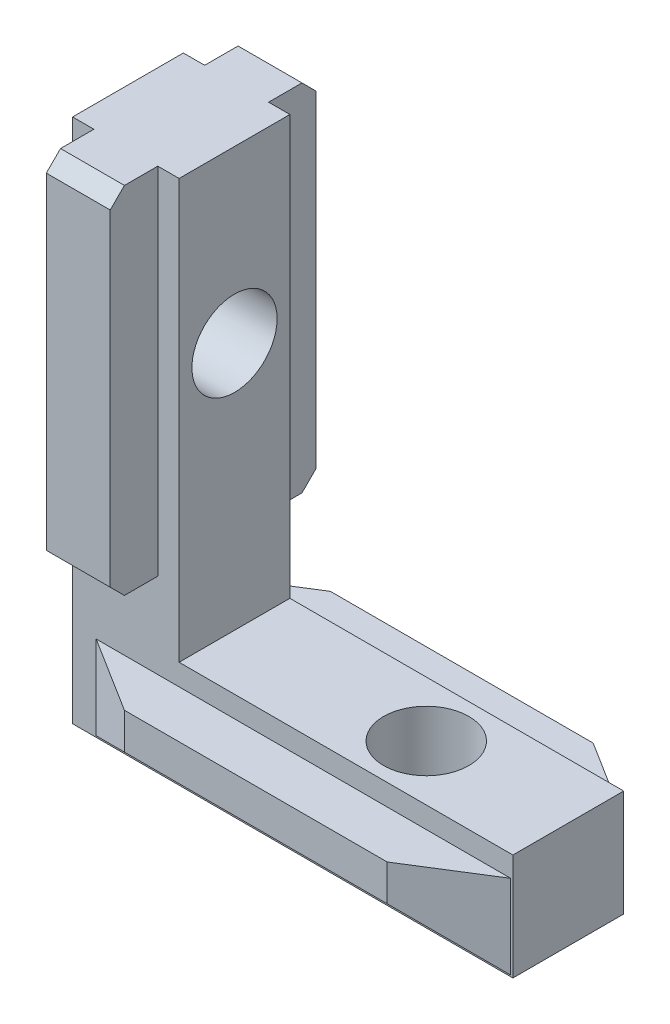
ISO-10303-21;
HEADER;
FILE_DESCRIPTION(('STEP AP214'),'2;1');
FILE_NAME('part.step','',(''),(''),'','','');
FILE_SCHEMA(('AUTOMOTIVE_DESIGN { 1 0 10303 214 1 1 1 1 }'));
ENDSEC;
DATA;
#1=APPLICATION_CONTEXT('core data for automotive mechanical design processes');
#2=APPLICATION_PROTOCOL_DEFINITION('international standard','automotive_design',2000,#1);
#3=PRODUCT_CONTEXT('',#1,'mechanical');
#4=PRODUCT('Part','Part','',(#3));
#5=PRODUCT_RELATED_PRODUCT_CATEGORY('part','',(#4));
#6=PRODUCT_DEFINITION_FORMATION('','',#4);
#7=PRODUCT_DEFINITION_CONTEXT('part definition',#1,'design');
#8=PRODUCT_DEFINITION('design','',#6,#7);
#9=PRODUCT_DEFINITION_SHAPE('','',#8);
#10=(LENGTH_UNIT() NAMED_UNIT(*) SI_UNIT(.MILLI.,.METRE.));
#11=(NAMED_UNIT(*) PLANE_ANGLE_UNIT() SI_UNIT($,.RADIAN.));
#12=(NAMED_UNIT(*) SI_UNIT($,.STERADIAN.) SOLID_ANGLE_UNIT());
#13=UNCERTAINTY_MEASURE_WITH_UNIT(LENGTH_MEASURE(1.E-05),#10,'distance_accuracy_value','');
#14=(GEOMETRIC_REPRESENTATION_CONTEXT(3) GLOBAL_UNCERTAINTY_ASSIGNED_CONTEXT((#13)) GLOBAL_UNIT_ASSIGNED_CONTEXT((#10,
#11,#12)) REPRESENTATION_CONTEXT('',''));
#15=CARTESIAN_POINT('',(0.,0.,0.));
#16=DIRECTION('',(0.,0.,1.));
#17=DIRECTION('',(1.,0.,0.));
#18=AXIS2_PLACEMENT_3D('',#15,#16,#17);
#19=CARTESIAN_POINT('',(0.,0.,-3.9));
#20=DIRECTION('',(0.,0.,1.));
#21=DIRECTION('',(1.,0.,0.));
#22=AXIS2_PLACEMENT_3D('',#19,#20,#21);
#23=PLANE('',#22);
#24=DIRECTION('',(0.,-1.,0.));
#25=VECTOR('',#24,1.);
#26=CARTESIAN_POINT('',(6.,12.,-3.9));
#27=LINE('',#26,#25);
#28=CARTESIAN_POINT('',(6.,37.,-3.9));
#29=VERTEX_POINT('',#28);
#30=CARTESIAN_POINT('',(6.,12.,-3.9));
#31=VERTEX_POINT('',#30);
#32=EDGE_CURVE('E418',#29,#31,#27,.T.);
#33=ORIENTED_EDGE('',*,*,#32,.F.);
#34=DIRECTION('',(-1.,0.,0.));
#35=VECTOR('',#34,1.);
#36=CARTESIAN_POINT('',(31.,37.,-3.9));
#37=LINE('',#36,#35);
#38=CARTESIAN_POINT('',(7.5,37.,-3.9));
#39=VERTEX_POINT('',#38);
#40=EDGE_CURVE('E372',#39,#29,#37,.T.);
#41=ORIENTED_EDGE('',*,*,#40,.F.);
#42=DIRECTION('',(0.,1.,0.));
#43=VECTOR('',#42,1.);
#44=CARTESIAN_POINT('',(7.5,7.5,-3.9));
#45=LINE('',#44,#43);
#46=CARTESIAN_POINT('',(7.5,7.5,-3.9));
#47=VERTEX_POINT('',#46);
#48=EDGE_CURVE('E353',#47,#39,#45,.T.);
#49=ORIENTED_EDGE('',*,*,#48,.F.);
#50=DIRECTION('',(-1.,0.,0.));
#51=VECTOR('',#50,1.);
#52=CARTESIAN_POINT('',(31.,7.5,-3.9));
#53=LINE('',#52,#51);
#54=CARTESIAN_POINT('',(31.,7.5,-3.9));
#55=VERTEX_POINT('',#54);
#56=EDGE_CURVE('E263',#55,#47,#53,.T.);
#57=ORIENTED_EDGE('',*,*,#56,.F.);
#58=DIRECTION('',(0.,1.,0.));
#59=VECTOR('',#58,1.);
#60=CARTESIAN_POINT('',(31.,0.,-3.9));
#61=LINE('',#60,#59);
#62=CARTESIAN_POINT('',(31.,0.,-3.9));
#63=VERTEX_POINT('',#62);
#64=EDGE_CURVE('E367',#63,#55,#61,.T.);
#65=ORIENTED_EDGE('',*,*,#64,.F.);
#66=DIRECTION('',(1.,0.,0.));
#67=VECTOR('',#66,1.);
#68=CARTESIAN_POINT('',(0.,0.,-3.9));
#69=LINE('',#68,#67);
#70=CARTESIAN_POINT('',(0.,0.,-3.9));
#71=VERTEX_POINT('',#70);
#72=EDGE_CURVE('E378',#71,#63,#69,.T.);
#73=ORIENTED_EDGE('',*,*,#72,.F.);
#74=DIRECTION('',(0.,-1.,0.));
#75=VECTOR('',#74,1.);
#76=CARTESIAN_POINT('',(0.,37.,-3.9));
#77=LINE('',#76,#75);
#78=CARTESIAN_POINT('',(0.,37.,-3.9));
#79=VERTEX_POINT('',#78);
#80=EDGE_CURVE('E375',#79,#71,#77,.T.);
#81=ORIENTED_EDGE('',*,*,#80,.F.);
#82=CARTESIAN_POINT('',(1.5,37.,-3.9));
#83=VERTEX_POINT('',#82);
#84=EDGE_CURVE('E370',#83,#79,#37,.T.);
#85=ORIENTED_EDGE('',*,*,#84,.F.);
#86=DIRECTION('',(0.,1.,0.));
#87=VECTOR('',#86,1.);
#88=CARTESIAN_POINT('',(1.5,37.,-3.9));
#89=LINE('',#88,#87);
#90=CARTESIAN_POINT('',(1.5,12.,-3.9));
#91=VERTEX_POINT('',#90);
#92=EDGE_CURVE('E424',#91,#83,#89,.T.);
#93=ORIENTED_EDGE('',*,*,#92,.F.);
#94=DIRECTION('',(-1.,0.,0.));
#95=VECTOR('',#94,1.);
#96=CARTESIAN_POINT('',(1.5,12.,-3.9));
#97=LINE('',#96,#95);
#98=EDGE_CURVE('E401',#31,#91,#97,.T.);
#99=ORIENTED_EDGE('',*,*,#98,.F.);
#100=EDGE_LOOP('',(#33,#41,#49,#57,#65,#73,#81,#85,#93,#99));
#101=FACE_BOUND('',#100,.T.);
#102=DIRECTION('',(1.,0.,0.));
#103=VECTOR('',#102,1.);
#104=CARTESIAN_POINT('',(30.8405797101493,6.,-3.9));
#105=LINE('',#104,#103);
#106=CARTESIAN_POINT('',(1.65942028985501,6.,-3.9));
#107=VERTEX_POINT('',#106);
#108=CARTESIAN_POINT('',(30.8405797101493,6.,-3.9));
#109=VERTEX_POINT('',#108);
#110=EDGE_CURVE('E212',#107,#109,#105,.T.);
#111=ORIENTED_EDGE('',*,*,#110,.F.);
#112=DIRECTION('',(0.,1.,0.));
#113=VECTOR('',#112,1.);
#114=CARTESIAN_POINT('',(1.65942028985501,6.,-3.9));
#115=LINE('',#114,#113);
#116=CARTESIAN_POINT('',(1.65942028985499,0.0999999999999989,-3.9));
#117=VERTEX_POINT('',#116);
#118=EDGE_CURVE('E214',#117,#107,#115,.T.);
#119=ORIENTED_EDGE('',*,*,#118,.F.);
#120=DIRECTION('',(-1.,0.,0.));
#121=VECTOR('',#120,1.);
#122=CARTESIAN_POINT('',(1.65942028985499,0.0999999999999989,-3.9));
#123=LINE('',#122,#121);
#124=CARTESIAN_POINT('',(30.8405797101493,0.0999999999999996,-3.9));
#125=VERTEX_POINT('',#124);
#126=EDGE_CURVE('E234',#125,#117,#123,.T.);
#127=ORIENTED_EDGE('',*,*,#126,.F.);
#128=DIRECTION('',(0.,-1.,0.));
#129=VECTOR('',#128,1.);
#130=CARTESIAN_POINT('',(30.8405797101493,0.0999999999999996,-3.9));
#131=LINE('',#130,#129);
#132=EDGE_CURVE('E217',#109,#125,#131,.T.);
#133=ORIENTED_EDGE('',*,*,#132,.F.);
#134=EDGE_LOOP('',(#111,#119,#127,#133));
#135=FACE_BOUND('',#134,.T.);
#136=ADVANCED_FACE('F41',(#101,#135),#23,.F.);
#137=CARTESIAN_POINT('',(0.,0.,3.9));
#138=DIRECTION('',(0.,0.,1.));
#139=DIRECTION('',(1.,0.,0.));
#140=AXIS2_PLACEMENT_3D('',#137,#138,#139);
#141=PLANE('',#140);
#142=DIRECTION('',(1.,0.,0.));
#143=VECTOR('',#142,1.);
#144=CARTESIAN_POINT('',(30.8405797101493,0.1,3.9));
#145=LINE('',#144,#143);
#146=CARTESIAN_POINT('',(1.659420289855,0.1,3.9));
#147=VERTEX_POINT('',#146);
#148=CARTESIAN_POINT('',(30.8405797101493,0.1,3.9));
#149=VERTEX_POINT('',#148);
#150=EDGE_CURVE('E343',#147,#149,#145,.T.);
#151=ORIENTED_EDGE('',*,*,#150,.F.);
#152=DIRECTION('',(0.,-1.,0.));
#153=VECTOR('',#152,1.);
#154=CARTESIAN_POINT('',(1.659420289855,0.1,3.9));
#155=LINE('',#154,#153);
#156=CARTESIAN_POINT('',(1.659420289855,6.,3.9));
#157=VERTEX_POINT('',#156);
#158=EDGE_CURVE('E339',#157,#147,#155,.T.);
#159=ORIENTED_EDGE('',*,*,#158,.F.);
#160=DIRECTION('',(-1.,0.,0.));
#161=VECTOR('',#160,1.);
#162=CARTESIAN_POINT('',(1.659420289855,6.,3.9));
#163=LINE('',#162,#161);
#164=CARTESIAN_POINT('',(30.8405797101493,6.,3.9));
#165=VERTEX_POINT('',#164);
#166=EDGE_CURVE('E261',#165,#157,#163,.T.);
#167=ORIENTED_EDGE('',*,*,#166,.F.);
#168=DIRECTION('',(0.,1.,0.));
#169=VECTOR('',#168,1.);
#170=CARTESIAN_POINT('',(30.8405797101493,6.,3.9));
#171=LINE('',#170,#169);
#172=EDGE_CURVE('E345',#149,#165,#171,.T.);
#173=ORIENTED_EDGE('',*,*,#172,.F.);
#174=EDGE_LOOP('',(#151,#159,#167,#173));
#175=FACE_BOUND('',#174,.T.);
#176=DIRECTION('',(-1.,0.,0.));
#177=VECTOR('',#176,1.);
#178=CARTESIAN_POINT('',(31.,37.,3.9));
#179=LINE('',#178,#177);
#180=CARTESIAN_POINT('',(7.5,37.,3.9));
#181=VERTEX_POINT('',#180);
#182=CARTESIAN_POINT('',(6.,37.,3.9));
#183=VERTEX_POINT('',#182);
#184=EDGE_CURVE('E384',#181,#183,#179,.T.);
#185=ORIENTED_EDGE('',*,*,#184,.T.);
#186=DIRECTION('',(0.,1.,0.));
#187=VECTOR('',#186,1.);
#188=CARTESIAN_POINT('',(6.,37.,3.9));
#189=LINE('',#188,#187);
#190=CARTESIAN_POINT('',(6.,12.,3.9));
#191=VERTEX_POINT('',#190);
#192=EDGE_CURVE('E440',#191,#183,#189,.T.);
#193=ORIENTED_EDGE('',*,*,#192,.F.);
#194=DIRECTION('',(1.,0.,0.));
#195=VECTOR('',#194,1.);
#196=CARTESIAN_POINT('',(6.,12.,3.9));
#197=LINE('',#196,#195);
#198=CARTESIAN_POINT('',(1.5,12.,3.9));
#199=VERTEX_POINT('',#198);
#200=EDGE_CURVE('E435',#199,#191,#197,.T.);
#201=ORIENTED_EDGE('',*,*,#200,.F.);
#202=DIRECTION('',(0.,-1.,0.));
#203=VECTOR('',#202,1.);
#204=CARTESIAN_POINT('',(1.5,12.,3.9));
#205=LINE('',#204,#203);
#206=CARTESIAN_POINT('',(1.5,37.,3.9));
#207=VERTEX_POINT('',#206);
#208=EDGE_CURVE('E316',#207,#199,#205,.T.);
#209=ORIENTED_EDGE('',*,*,#208,.F.);
#210=CARTESIAN_POINT('',(0.,37.,3.9));
#211=VERTEX_POINT('',#210);
#212=EDGE_CURVE('E329',#207,#211,#179,.T.);
#213=ORIENTED_EDGE('',*,*,#212,.T.);
#214=DIRECTION('',(0.,-1.,0.));
#215=VECTOR('',#214,1.);
#216=CARTESIAN_POINT('',(0.,37.,3.9));
#217=LINE('',#216,#215);
#218=CARTESIAN_POINT('',(0.,0.,3.9));
#219=VERTEX_POINT('',#218);
#220=EDGE_CURVE('E387',#211,#219,#217,.T.);
#221=ORIENTED_EDGE('',*,*,#220,.T.);
#222=DIRECTION('',(1.,0.,0.));
#223=VECTOR('',#222,1.);
#224=CARTESIAN_POINT('',(0.,0.,3.9));
#225=LINE('',#224,#223);
#226=CARTESIAN_POINT('',(31.,0.,3.9));
#227=VERTEX_POINT('',#226);
#228=EDGE_CURVE('E371',#219,#227,#225,.T.);
#229=ORIENTED_EDGE('',*,*,#228,.T.);
#230=DIRECTION('',(0.,1.,0.));
#231=VECTOR('',#230,1.);
#232=CARTESIAN_POINT('',(31.,0.,3.9));
#233=LINE('',#232,#231);
#234=CARTESIAN_POINT('',(31.,7.5,3.9));
#235=VERTEX_POINT('',#234);
#236=EDGE_CURVE('E363',#227,#235,#233,.T.);
#237=ORIENTED_EDGE('',*,*,#236,.T.);
#238=DIRECTION('',(-1.,0.,0.));
#239=VECTOR('',#238,1.);
#240=CARTESIAN_POINT('',(31.,7.5,3.9));
#241=LINE('',#240,#239);
#242=CARTESIAN_POINT('',(7.5,7.5,3.9));
#243=VERTEX_POINT('',#242);
#244=EDGE_CURVE('E349',#235,#243,#241,.T.);
#245=ORIENTED_EDGE('',*,*,#244,.T.);
#246=DIRECTION('',(0.,1.,0.));
#247=VECTOR('',#246,1.);
#248=CARTESIAN_POINT('',(7.5,7.5,3.9));
#249=LINE('',#248,#247);
#250=EDGE_CURVE('E352',#243,#181,#249,.T.);
#251=ORIENTED_EDGE('',*,*,#250,.T.);
#252=EDGE_LOOP('',(#185,#193,#201,#209,#213,#221,#229,#237,#245,#251));
#253=FACE_BOUND('',#252,.T.);
#254=ADVANCED_FACE('F444',(#175,#253),#141,.T.);
#255=CARTESIAN_POINT('',(31.,0.,-3.9));
#256=DIRECTION('',(1.,0.,0.));
#257=DIRECTION('',(0.,0.,-1.));
#258=AXIS2_PLACEMENT_3D('',#255,#256,#257);
#259=PLANE('',#258);
#260=DIRECTION('',(0.,0.,-1.));
#261=VECTOR('',#260,1.);
#262=CARTESIAN_POINT('',(31.,7.5,3.9));
#263=LINE('',#262,#261);
#264=EDGE_CURVE('E356',#235,#55,#263,.T.);
#265=ORIENTED_EDGE('',*,*,#264,.F.);
#266=ORIENTED_EDGE('',*,*,#236,.F.);
#267=DIRECTION('',(0.,0.,1.));
#268=VECTOR('',#267,1.);
#269=CARTESIAN_POINT('',(31.,0.,-3.9));
#270=LINE('',#269,#268);
#271=EDGE_CURVE('E273',#63,#227,#270,.T.);
#272=ORIENTED_EDGE('',*,*,#271,.F.);
#273=ORIENTED_EDGE('',*,*,#64,.T.);
#274=EDGE_LOOP('',(#265,#266,#272,#273));
#275=FACE_BOUND('',#274,.T.);
#276=ADVANCED_FACE('F464',(#275),#259,.T.);
#277=CARTESIAN_POINT('',(0.,0.,-3.9));
#278=DIRECTION('',(0.,-1.,0.));
#279=DIRECTION('',(1.,0.,0.));
#280=AXIS2_PLACEMENT_3D('',#277,#278,#279);
#281=PLANE('',#280);
#282=CARTESIAN_POINT('',(21.,0.,0.));
#283=DIRECTION('',(0.,-1.,0.));
#284=DIRECTION('',(0.,0.,-1.));
#285=AXIS2_PLACEMENT_3D('',#282,#283,#284);
#286=CIRCLE('',#285,2.99999999999999);
#287=CARTESIAN_POINT('',(21.,0.,-2.99999999999999));
#288=VERTEX_POINT('',#287);
#289=EDGE_CURVE('E268',#288,#288,#286,.T.);
#290=ORIENTED_EDGE('',*,*,#289,.F.);
#291=EDGE_LOOP('',(#290));
#292=FACE_BOUND('',#291,.T.);
#293=ORIENTED_EDGE('',*,*,#228,.F.);
#294=DIRECTION('',(0.,0.,1.));
#295=VECTOR('',#294,1.);
#296=CARTESIAN_POINT('',(0.,0.,-3.9));
#297=LINE('',#296,#295);
#298=EDGE_CURVE('E393',#71,#219,#297,.T.);
#299=ORIENTED_EDGE('',*,*,#298,.F.);
#300=ORIENTED_EDGE('',*,*,#72,.T.);
#301=ORIENTED_EDGE('',*,*,#271,.T.);
#302=EDGE_LOOP('',(#293,#299,#300,#301));
#303=FACE_BOUND('',#302,.T.);
#304=ADVANCED_FACE('F472',(#292,#303),#281,.T.);
#305=CARTESIAN_POINT('',(0.,37.,-3.9));
#306=DIRECTION('',(-1.,0.,0.));
#307=DIRECTION('',(0.,0.,1.));
#308=AXIS2_PLACEMENT_3D('',#305,#306,#307);
#309=PLANE('',#308);
#310=CARTESIAN_POINT('',(0.,25.,0.));
#311=DIRECTION('',(1.,0.,0.));
#312=DIRECTION('',(0.,0.,-1.));
#313=AXIS2_PLACEMENT_3D('',#310,#311,#312);
#314=CIRCLE('',#313,2.99999999999999);
#315=CARTESIAN_POINT('',(0.,25.,-2.99999999999999));
#316=VERTEX_POINT('',#315);
#317=EDGE_CURVE('E222',#316,#316,#314,.T.);
#318=ORIENTED_EDGE('',*,*,#317,.T.);
#319=EDGE_LOOP('',(#318));
#320=FACE_BOUND('',#319,.T.);
#321=ORIENTED_EDGE('',*,*,#220,.F.);
#322=DIRECTION('',(0.,0.,1.));
#323=VECTOR('',#322,1.);
#324=CARTESIAN_POINT('',(0.,37.,-3.9));
#325=LINE('',#324,#323);
#326=EDGE_CURVE('E381',#79,#211,#325,.T.);
#327=ORIENTED_EDGE('',*,*,#326,.F.);
#328=ORIENTED_EDGE('',*,*,#80,.T.);
#329=ORIENTED_EDGE('',*,*,#298,.T.);
#330=EDGE_LOOP('',(#321,#327,#328,#329));
#331=FACE_BOUND('',#330,.T.);
#332=ADVANCED_FACE('F475',(#320,#331),#309,.T.);
#333=CARTESIAN_POINT('',(31.,37.,-3.9));
#334=DIRECTION('',(0.,1.,0.));
#335=DIRECTION('',(0.,0.,1.));
#336=AXIS2_PLACEMENT_3D('',#333,#334,#335);
#337=PLANE('',#336);
#338=DIRECTION('',(0.,0.,1.));
#339=VECTOR('',#338,1.);
#340=CARTESIAN_POINT('',(6.,37.,-7.25));
#341=LINE('',#340,#339);
#342=CARTESIAN_POINT('',(6.,37.,-6.24999999999999));
#343=VERTEX_POINT('',#342);
#344=EDGE_CURVE('E430',#343,#29,#341,.T.);
#345=ORIENTED_EDGE('',*,*,#344,.F.);
#346=DIRECTION('',(-1.,0.,0.));
#347=VECTOR('',#346,1.);
#348=CARTESIAN_POINT('',(1.5,37.,-6.24999999999999));
#349=LINE('',#348,#347);
#350=CARTESIAN_POINT('',(1.5,37.,-6.24999999999999));
#351=VERTEX_POINT('',#350);
#352=EDGE_CURVE('E282',#343,#351,#349,.T.);
#353=ORIENTED_EDGE('',*,*,#352,.T.);
#354=DIRECTION('',(0.,0.,1.));
#355=VECTOR('',#354,1.);
#356=CARTESIAN_POINT('',(1.5,37.,-7.25));
#357=LINE('',#356,#355);
#358=EDGE_CURVE('E432',#351,#83,#357,.T.);
#359=ORIENTED_EDGE('',*,*,#358,.T.);
#360=ORIENTED_EDGE('',*,*,#84,.T.);
#361=ORIENTED_EDGE('',*,*,#326,.T.);
#362=ORIENTED_EDGE('',*,*,#212,.F.);
#363=DIRECTION('',(0.,0.,-1.));
#364=VECTOR('',#363,1.);
#365=CARTESIAN_POINT('',(1.5,37.,7.25));
#366=LINE('',#365,#364);
#367=CARTESIAN_POINT('',(1.5,37.,6.24999999999999));
#368=VERTEX_POINT('',#367);
#369=EDGE_CURVE('E323',#368,#207,#366,.T.);
#370=ORIENTED_EDGE('',*,*,#369,.F.);
#371=DIRECTION('',(1.,0.,0.));
#372=VECTOR('',#371,1.);
#373=CARTESIAN_POINT('',(6.,37.,6.24999999999999));
#374=LINE('',#373,#372);
#375=CARTESIAN_POINT('',(6.,37.,6.24999999999999));
#376=VERTEX_POINT('',#375);
#377=EDGE_CURVE('E280',#368,#376,#374,.T.);
#378=ORIENTED_EDGE('',*,*,#377,.T.);
#379=DIRECTION('',(0.,0.,-1.));
#380=VECTOR('',#379,1.);
#381=CARTESIAN_POINT('',(6.,37.,7.25));
#382=LINE('',#381,#380);
#383=EDGE_CURVE('E306',#376,#183,#382,.T.);
#384=ORIENTED_EDGE('',*,*,#383,.T.);
#385=ORIENTED_EDGE('',*,*,#184,.F.);
#386=DIRECTION('',(0.,0.,-1.));
#387=VECTOR('',#386,1.);
#388=CARTESIAN_POINT('',(7.5,37.,3.9));
#389=LINE('',#388,#387);
#390=EDGE_CURVE('E360',#181,#39,#389,.T.);
#391=ORIENTED_EDGE('',*,*,#390,.T.);
#392=ORIENTED_EDGE('',*,*,#40,.T.);
#393=EDGE_LOOP('',(#345,#353,#359,#360,#361,#362,#370,#378,#384,#385,#391,#392));
#394=FACE_BOUND('',#393,.T.);
#395=ADVANCED_FACE('F327',(#394),#337,.T.);
#396=CARTESIAN_POINT('',(7.5,7.5,3.9));
#397=DIRECTION('',(-1.,0.,0.));
#398=DIRECTION('',(0.,0.,1.));
#399=AXIS2_PLACEMENT_3D('',#396,#397,#398);
#400=PLANE('',#399);
#401=CARTESIAN_POINT('',(7.5,25.,0.));
#402=DIRECTION('',(1.,0.,0.));
#403=DIRECTION('',(0.,0.,-1.));
#404=AXIS2_PLACEMENT_3D('',#401,#402,#403);
#405=CIRCLE('',#404,2.99999999999999);
#406=CARTESIAN_POINT('',(7.5,25.,-2.99999999999999));
#407=VERTEX_POINT('',#406);
#408=EDGE_CURVE('E267',#407,#407,#405,.T.);
#409=ORIENTED_EDGE('',*,*,#408,.F.);
#410=EDGE_LOOP('',(#409));
#411=FACE_BOUND('',#410,.T.);
#412=ORIENTED_EDGE('',*,*,#48,.T.);
#413=ORIENTED_EDGE('',*,*,#390,.F.);
#414=ORIENTED_EDGE('',*,*,#250,.F.);
#415=DIRECTION('',(0.,0.,-1.));
#416=VECTOR('',#415,1.);
#417=CARTESIAN_POINT('',(7.5,7.5,3.9));
#418=LINE('',#417,#416);
#419=EDGE_CURVE('E364',#243,#47,#418,.T.);
#420=ORIENTED_EDGE('',*,*,#419,.T.);
#421=EDGE_LOOP('',(#412,#413,#414,#420));
#422=FACE_BOUND('',#421,.T.);
#423=ADVANCED_FACE('F482',(#411,#422),#400,.F.);
#424=CARTESIAN_POINT('',(31.,7.5,3.9));
#425=DIRECTION('',(0.,-1.,0.));
#426=DIRECTION('',(0.,0.,-1.));
#427=AXIS2_PLACEMENT_3D('',#424,#425,#426);
#428=PLANE('',#427);
#429=CARTESIAN_POINT('',(21.,7.5,0.));
#430=DIRECTION('',(0.,-1.,0.));
#431=DIRECTION('',(0.,0.,-1.));
#432=AXIS2_PLACEMENT_3D('',#429,#430,#431);
#433=CIRCLE('',#432,2.99999999999999);
#434=CARTESIAN_POINT('',(21.,7.5,-2.99999999999999));
#435=VERTEX_POINT('',#434);
#436=EDGE_CURVE('E264',#435,#435,#433,.T.);
#437=ORIENTED_EDGE('',*,*,#436,.T.);
#438=EDGE_LOOP('',(#437));
#439=FACE_BOUND('',#438,.T.);
#440=ORIENTED_EDGE('',*,*,#56,.T.);
#441=ORIENTED_EDGE('',*,*,#419,.F.);
#442=ORIENTED_EDGE('',*,*,#244,.F.);
#443=ORIENTED_EDGE('',*,*,#264,.T.);
#444=EDGE_LOOP('',(#440,#441,#442,#443));
#445=FACE_BOUND('',#444,.T.);
#446=ADVANCED_FACE('F469',(#439,#445),#428,.F.);
#447=CARTESIAN_POINT('',(1.659420289855,0.1,3.9));
#448=DIRECTION('',(-0.531382718815383,0.,0.847131870575279));
#449=DIRECTION('',(0.847131870575279,0.,0.531382718815383));
#450=AXIS2_PLACEMENT_3D('',#447,#448,#449);
#451=PLANE('',#450);
#452=ORIENTED_EDGE('',*,*,#158,.T.);
#453=DIRECTION('',(-0.748074332358689,-0.469246626661346,-0.469246626661342));
#454=VECTOR('',#453,1.);
#455=CARTESIAN_POINT('',(17.9896408515778,10.3435019887168,14.1435019887167));
#456=LINE('',#455,#454);
#457=CARTESIAN_POINT('',(7.00000000000012,3.45000000000002,7.25));
#458=VERTEX_POINT('',#457);
#459=EDGE_CURVE('E248',#458,#147,#456,.T.);
#460=ORIENTED_EDGE('',*,*,#459,.F.);
#461=DIRECTION('',(0.,1.,0.));
#462=VECTOR('',#461,1.);
#463=CARTESIAN_POINT('',(7.00000000000012,0.,7.25));
#464=LINE('',#463,#462);
#465=CARTESIAN_POINT('',(7.00000000000012,6.,7.25));
#466=VERTEX_POINT('',#465);
#467=EDGE_CURVE('E258',#466,#458,#464,.F.);
#468=ORIENTED_EDGE('',*,*,#467,.F.);
#469=DIRECTION('',(0.847131870575279,0.,0.531382718815383));
#470=VECTOR('',#469,1.);
#471=CARTESIAN_POINT('',(1.659420289855,6.,3.9));
#472=LINE('',#471,#470);
#473=EDGE_CURVE('E255',#466,#157,#472,.F.);
#474=ORIENTED_EDGE('',*,*,#473,.T.);
#475=EDGE_LOOP('',(#452,#460,#468,#474));
#476=FACE_BOUND('',#475,.T.);
#477=ADVANCED_FACE('F492',(#476),#451,.T.);
#478=CARTESIAN_POINT('',(30.8405797101493,0.1,3.9));
#479=DIRECTION('',(0.,-0.707106781186545,0.70710678118655));
#480=DIRECTION('',(0.,-0.70710678118655,-0.707106781186545));
#481=AXIS2_PLACEMENT_3D('',#478,#479,#480);
#482=PLANE('',#481);
#483=ORIENTED_EDGE('',*,*,#150,.T.);
#484=DIRECTION('',(0.748074332358689,-0.469246626661346,-0.469246626661342));
#485=VECTOR('',#484,1.);
#486=CARTESIAN_POINT('',(28.7694947041369,1.39913514013501,5.199135140135));
#487=LINE('',#486,#485);
#488=CARTESIAN_POINT('',(25.5000000000042,3.45000000000002,7.25));
#489=VERTEX_POINT('',#488);
#490=EDGE_CURVE('E245',#489,#149,#487,.T.);
#491=ORIENTED_EDGE('',*,*,#490,.F.);
#492=DIRECTION('',(-1.,0.,0.));
#493=VECTOR('',#492,1.);
#494=CARTESIAN_POINT('',(0.,3.45000000000002,7.25));
#495=LINE('',#494,#493);
#496=EDGE_CURVE('E253',#458,#489,#495,.F.);
#497=ORIENTED_EDGE('',*,*,#496,.F.);
#498=ORIENTED_EDGE('',*,*,#459,.T.);
#499=EDGE_LOOP('',(#483,#491,#497,#498));
#500=FACE_BOUND('',#499,.T.);
#501=ADVANCED_FACE('F488',(#500),#482,.T.);
#502=CARTESIAN_POINT('',(30.8405797101493,6.,3.9));
#503=DIRECTION('',(0.531382718815383,0.,0.847131870575279));
#504=DIRECTION('',(0.847131870575279,0.,-0.531382718815383));
#505=AXIS2_PLACEMENT_3D('',#502,#503,#504);
#506=PLANE('',#505);
#507=ORIENTED_EDGE('',*,*,#172,.T.);
#508=DIRECTION('',(-0.847131870575279,0.,0.531382718815383));
#509=VECTOR('',#508,1.);
#510=CARTESIAN_POINT('',(8.39122741873314,6.,17.9818664373424));
#511=LINE('',#510,#509);
#512=CARTESIAN_POINT('',(25.5000000000042,6.,7.25));
#513=VERTEX_POINT('',#512);
#514=EDGE_CURVE('E249',#513,#165,#511,.F.);
#515=ORIENTED_EDGE('',*,*,#514,.F.);
#516=DIRECTION('',(0.,-1.,0.));
#517=VECTOR('',#516,1.);
#518=CARTESIAN_POINT('',(25.5000000000042,0.,7.25));
#519=LINE('',#518,#517);
#520=EDGE_CURVE('E250',#489,#513,#519,.F.);
#521=ORIENTED_EDGE('',*,*,#520,.F.);
#522=ORIENTED_EDGE('',*,*,#490,.T.);
#523=EDGE_LOOP('',(#507,#515,#521,#522));
#524=FACE_BOUND('',#523,.T.);
#525=ADVANCED_FACE('F491',(#524),#506,.T.);
#526=CARTESIAN_POINT('',(1.659420289855,6.,7.25));
#527=DIRECTION('',(0.,-1.,0.));
#528=DIRECTION('',(0.,0.,-1.));
#529=AXIS2_PLACEMENT_3D('',#526,#527,#528);
#530=PLANE('',#529);
#531=ORIENTED_EDGE('',*,*,#166,.T.);
#532=ORIENTED_EDGE('',*,*,#473,.F.);
#533=DIRECTION('',(-1.,0.,0.));
#534=VECTOR('',#533,1.);
#535=CARTESIAN_POINT('',(1.659420289855,6.,7.25));
#536=LINE('',#535,#534);
#537=EDGE_CURVE('E252',#513,#466,#536,.T.);
#538=ORIENTED_EDGE('',*,*,#537,.F.);
#539=ORIENTED_EDGE('',*,*,#514,.T.);
#540=EDGE_LOOP('',(#531,#532,#538,#539));
#541=FACE_BOUND('',#540,.T.);
#542=ADVANCED_FACE('F501',(#541),#530,.F.);
#543=CARTESIAN_POINT('',(0.,0.,7.25));
#544=DIRECTION('',(0.,0.,-1.));
#545=DIRECTION('',(-1.,0.,0.));
#546=AXIS2_PLACEMENT_3D('',#543,#544,#545);
#547=PLANE('',#546);
#548=ORIENTED_EDGE('',*,*,#467,.T.);
#549=ORIENTED_EDGE('',*,*,#496,.T.);
#550=ORIENTED_EDGE('',*,*,#520,.T.);
#551=ORIENTED_EDGE('',*,*,#537,.T.);
#552=EDGE_LOOP('',(#548,#549,#550,#551));
#553=FACE_BOUND('',#552,.T.);
#554=ADVANCED_FACE('F578',(#553),#547,.F.);
#555=CARTESIAN_POINT('',(6.,12.,7.25));
#556=DIRECTION('',(0.,1.,0.));
#557=DIRECTION('',(0.,0.,1.));
#558=AXIS2_PLACEMENT_3D('',#555,#556,#557);
#559=PLANE('',#558);
#560=DIRECTION('',(0.,0.,-1.));
#561=VECTOR('',#560,1.);
#562=CARTESIAN_POINT('',(6.,12.,7.25));
#563=LINE('',#562,#561);
#564=CARTESIAN_POINT('',(6.,12.,6.24999999999999));
#565=VERTEX_POINT('',#564);
#566=EDGE_CURVE('E333',#565,#191,#563,.T.);
#567=ORIENTED_EDGE('',*,*,#566,.F.);
#568=DIRECTION('',(-1.,0.,0.));
#569=VECTOR('',#568,1.);
#570=CARTESIAN_POINT('',(6.,12.,6.24999999999999));
#571=LINE('',#570,#569);
#572=CARTESIAN_POINT('',(1.5,12.,6.24999999999999));
#573=VERTEX_POINT('',#572);
#574=EDGE_CURVE('E50',#565,#573,#571,.T.);
#575=ORIENTED_EDGE('',*,*,#574,.T.);
#576=DIRECTION('',(0.,0.,-1.));
#577=VECTOR('',#576,1.);
#578=CARTESIAN_POINT('',(1.5,12.,7.25));
#579=LINE('',#578,#577);
#580=EDGE_CURVE('E331',#573,#199,#579,.T.);
#581=ORIENTED_EDGE('',*,*,#580,.T.);
#582=ORIENTED_EDGE('',*,*,#200,.T.);
#583=EDGE_LOOP('',(#567,#575,#581,#582));
#584=FACE_BOUND('',#583,.T.);
#585=ADVANCED_FACE('F446',(#584),#559,.F.);
#586=CARTESIAN_POINT('',(6.,37.,7.25));
#587=DIRECTION('',(-1.,0.,0.));
#588=DIRECTION('',(0.,-1.,0.));
#589=AXIS2_PLACEMENT_3D('',#586,#587,#588);
#590=PLANE('',#589);
#591=ORIENTED_EDGE('',*,*,#383,.F.);
#592=DIRECTION('',(0.,-0.707106781186543,0.707106781186552));
#593=VECTOR('',#592,1.);
#594=CARTESIAN_POINT('',(6.,36.,7.25));
#595=LINE('',#594,#593);
#596=CARTESIAN_POINT('',(6.,36.,7.25));
#597=VERTEX_POINT('',#596);
#598=EDGE_CURVE('E299',#376,#597,#595,.T.);
#599=ORIENTED_EDGE('',*,*,#598,.T.);
#600=DIRECTION('',(0.,1.,0.));
#601=VECTOR('',#600,1.);
#602=CARTESIAN_POINT('',(6.,37.,7.25));
#603=LINE('',#602,#601);
#604=CARTESIAN_POINT('',(6.,13.,7.25));
#605=VERTEX_POINT('',#604);
#606=EDGE_CURVE('E304',#605,#597,#603,.T.);
#607=ORIENTED_EDGE('',*,*,#606,.F.);
#608=DIRECTION('',(0.,0.707106781186545,0.70710678118655));
#609=VECTOR('',#608,1.);
#610=CARTESIAN_POINT('',(6.,13.,7.25));
#611=LINE('',#610,#609);
#612=EDGE_CURVE('E57',#605,#565,#611,.F.);
#613=ORIENTED_EDGE('',*,*,#612,.T.);
#614=ORIENTED_EDGE('',*,*,#566,.T.);
#615=ORIENTED_EDGE('',*,*,#192,.T.);
#616=EDGE_LOOP('',(#591,#599,#607,#613,#614,#615));
#617=FACE_BOUND('',#616,.T.);
#618=ADVANCED_FACE('F303',(#617),#590,.F.);
#619=CARTESIAN_POINT('',(1.5,12.,7.25));
#620=DIRECTION('',(1.,0.,0.));
#621=DIRECTION('',(0.,1.,0.));
#622=AXIS2_PLACEMENT_3D('',#619,#620,#621);
#623=PLANE('',#622);
#624=DIRECTION('',(0.,-1.,0.));
#625=VECTOR('',#624,1.);
#626=CARTESIAN_POINT('',(1.5,12.,7.25));
#627=LINE('',#626,#625);
#628=CARTESIAN_POINT('',(1.5,36.,7.25));
#629=VERTEX_POINT('',#628);
#630=CARTESIAN_POINT('',(1.5,13.,7.25));
#631=VERTEX_POINT('',#630);
#632=EDGE_CURVE('E315',#629,#631,#627,.T.);
#633=ORIENTED_EDGE('',*,*,#632,.F.);
#634=DIRECTION('',(0.,0.707106781186543,-0.707106781186552));
#635=VECTOR('',#634,1.);
#636=CARTESIAN_POINT('',(1.5,36.,7.25));
#637=LINE('',#636,#635);
#638=EDGE_CURVE('E296',#629,#368,#637,.T.);
#639=ORIENTED_EDGE('',*,*,#638,.T.);
#640=ORIENTED_EDGE('',*,*,#369,.T.);
#641=ORIENTED_EDGE('',*,*,#208,.T.);
#642=ORIENTED_EDGE('',*,*,#580,.F.);
#643=DIRECTION('',(0.,-0.707106781186545,-0.70710678118655));
#644=VECTOR('',#643,1.);
#645=CARTESIAN_POINT('',(1.5,13.,7.25));
#646=LINE('',#645,#644);
#647=EDGE_CURVE('E294',#573,#631,#646,.F.);
#648=ORIENTED_EDGE('',*,*,#647,.T.);
#649=EDGE_LOOP('',(#633,#639,#640,#641,#642,#648));
#650=FACE_BOUND('',#649,.T.);
#651=ADVANCED_FACE('F321',(#650),#623,.F.);
#652=CARTESIAN_POINT('',(0.,0.,7.25));
#653=DIRECTION('',(0.,0.,-1.));
#654=DIRECTION('',(-1.,0.,0.));
#655=AXIS2_PLACEMENT_3D('',#652,#653,#654);
#656=PLANE('',#655);
#657=ORIENTED_EDGE('',*,*,#606,.T.);
#658=DIRECTION('',(-1.,0.,0.));
#659=VECTOR('',#658,1.);
#660=CARTESIAN_POINT('',(1.5,36.,7.25));
#661=LINE('',#660,#659);
#662=EDGE_CURVE('E291',#597,#629,#661,.T.);
#663=ORIENTED_EDGE('',*,*,#662,.T.);
#664=ORIENTED_EDGE('',*,*,#632,.T.);
#665=DIRECTION('',(1.,0.,0.));
#666=VECTOR('',#665,1.);
#667=CARTESIAN_POINT('',(0.,13.,7.25));
#668=LINE('',#667,#666);
#669=EDGE_CURVE('E288',#631,#605,#668,.T.);
#670=ORIENTED_EDGE('',*,*,#669,.T.);
#671=EDGE_LOOP('',(#657,#663,#664,#670));
#672=FACE_BOUND('',#671,.T.);
#673=ADVANCED_FACE('F311',(#672),#656,.F.);
#674=CARTESIAN_POINT('',(1.5,12.,-7.25));
#675=DIRECTION('',(0.,1.,0.));
#676=DIRECTION('',(0.,0.,1.));
#677=AXIS2_PLACEMENT_3D('',#674,#675,#676);
#678=PLANE('',#677);
#679=DIRECTION('',(0.,0.,1.));
#680=VECTOR('',#679,1.);
#681=CARTESIAN_POINT('',(1.5,12.,-7.25));
#682=LINE('',#681,#680);
#683=CARTESIAN_POINT('',(1.5,12.,-6.24999999999999));
#684=VERTEX_POINT('',#683);
#685=EDGE_CURVE('E434',#684,#91,#682,.T.);
#686=ORIENTED_EDGE('',*,*,#685,.F.);
#687=DIRECTION('',(1.,0.,0.));
#688=VECTOR('',#687,1.);
#689=CARTESIAN_POINT('',(1.5,12.,-6.24999999999999));
#690=LINE('',#689,#688);
#691=CARTESIAN_POINT('',(6.,12.,-6.24999999999999));
#692=VERTEX_POINT('',#691);
#693=EDGE_CURVE('E11',#684,#692,#690,.T.);
#694=ORIENTED_EDGE('',*,*,#693,.T.);
#695=DIRECTION('',(0.,0.,1.));
#696=VECTOR('',#695,1.);
#697=CARTESIAN_POINT('',(6.,12.,-7.25));
#698=LINE('',#697,#696);
#699=EDGE_CURVE('E421',#692,#31,#698,.T.);
#700=ORIENTED_EDGE('',*,*,#699,.T.);
#701=ORIENTED_EDGE('',*,*,#98,.T.);
#702=EDGE_LOOP('',(#686,#694,#700,#701));
#703=FACE_BOUND('',#702,.T.);
#704=ADVANCED_FACE('F541',(#703),#678,.F.);
#705=CARTESIAN_POINT('',(1.5,37.,-7.25));
#706=DIRECTION('',(1.,0.,0.));
#707=DIRECTION('',(0.,1.,0.));
#708=AXIS2_PLACEMENT_3D('',#705,#706,#707);
#709=PLANE('',#708);
#710=ORIENTED_EDGE('',*,*,#358,.F.);
#711=DIRECTION('',(0.,-0.707106781186543,-0.707106781186552));
#712=VECTOR('',#711,1.);
#713=CARTESIAN_POINT('',(1.5,36.,-7.25));
#714=LINE('',#713,#712);
#715=CARTESIAN_POINT('',(1.5,36.,-7.25));
#716=VERTEX_POINT('',#715);
#717=EDGE_CURVE('E286',#351,#716,#714,.T.);
#718=ORIENTED_EDGE('',*,*,#717,.T.);
#719=DIRECTION('',(0.,1.,0.));
#720=VECTOR('',#719,1.);
#721=CARTESIAN_POINT('',(1.5,37.,-7.25));
#722=LINE('',#721,#720);
#723=CARTESIAN_POINT('',(1.5,13.,-7.25));
#724=VERTEX_POINT('',#723);
#725=EDGE_CURVE('E414',#724,#716,#722,.T.);
#726=ORIENTED_EDGE('',*,*,#725,.F.);
#727=DIRECTION('',(0.,0.707106781186545,-0.70710678118655));
#728=VECTOR('',#727,1.);
#729=CARTESIAN_POINT('',(1.5,13.,-7.25));
#730=LINE('',#729,#728);
#731=EDGE_CURVE('E284',#724,#684,#730,.F.);
#732=ORIENTED_EDGE('',*,*,#731,.T.);
#733=ORIENTED_EDGE('',*,*,#685,.T.);
#734=ORIENTED_EDGE('',*,*,#92,.T.);
#735=EDGE_LOOP('',(#710,#718,#726,#732,#733,#734));
#736=FACE_BOUND('',#735,.T.);
#737=ADVANCED_FACE('F531',(#736),#709,.F.);
#738=CARTESIAN_POINT('',(6.,12.,-7.25));
#739=DIRECTION('',(-1.,0.,0.));
#740=DIRECTION('',(0.,-1.,0.));
#741=AXIS2_PLACEMENT_3D('',#738,#739,#740);
#742=PLANE('',#741);
#743=DIRECTION('',(0.,-1.,0.));
#744=VECTOR('',#743,1.);
#745=CARTESIAN_POINT('',(6.,12.,-7.25));
#746=LINE('',#745,#744);
#747=CARTESIAN_POINT('',(6.,36.,-7.25));
#748=VERTEX_POINT('',#747);
#749=CARTESIAN_POINT('',(6.,13.,-7.25));
#750=VERTEX_POINT('',#749);
#751=EDGE_CURVE('E417',#748,#750,#746,.T.);
#752=ORIENTED_EDGE('',*,*,#751,.F.);
#753=DIRECTION('',(0.,0.707106781186543,0.707106781186552));
#754=VECTOR('',#753,1.);
#755=CARTESIAN_POINT('',(6.,36.,-7.25));
#756=LINE('',#755,#754);
#757=EDGE_CURVE('E278',#748,#343,#756,.T.);
#758=ORIENTED_EDGE('',*,*,#757,.T.);
#759=ORIENTED_EDGE('',*,*,#344,.T.);
#760=ORIENTED_EDGE('',*,*,#32,.T.);
#761=ORIENTED_EDGE('',*,*,#699,.F.);
#762=DIRECTION('',(0.,-0.707106781186545,0.70710678118655));
#763=VECTOR('',#762,1.);
#764=CARTESIAN_POINT('',(6.,13.,-7.25));
#765=LINE('',#764,#763);
#766=EDGE_CURVE('E276',#692,#750,#765,.F.);
#767=ORIENTED_EDGE('',*,*,#766,.T.);
#768=EDGE_LOOP('',(#752,#758,#759,#760,#761,#767));
#769=FACE_BOUND('',#768,.T.);
#770=ADVANCED_FACE('F547',(#769),#742,.F.);
#771=CARTESIAN_POINT('',(0.,0.,-7.25));
#772=DIRECTION('',(0.,0.,1.));
#773=DIRECTION('',(1.,0.,0.));
#774=AXIS2_PLACEMENT_3D('',#771,#772,#773);
#775=PLANE('',#774);
#776=ORIENTED_EDGE('',*,*,#725,.T.);
#777=DIRECTION('',(1.,0.,0.));
#778=VECTOR('',#777,1.);
#779=CARTESIAN_POINT('',(6.,36.,-7.25));
#780=LINE('',#779,#778);
#781=EDGE_CURVE('E272',#716,#748,#780,.T.);
#782=ORIENTED_EDGE('',*,*,#781,.T.);
#783=ORIENTED_EDGE('',*,*,#751,.T.);
#784=DIRECTION('',(-1.,0.,0.));
#785=VECTOR('',#784,1.);
#786=CARTESIAN_POINT('',(0.,13.,-7.25));
#787=LINE('',#786,#785);
#788=EDGE_CURVE('E269',#750,#724,#787,.T.);
#789=ORIENTED_EDGE('',*,*,#788,.T.);
#790=EDGE_LOOP('',(#776,#782,#783,#789));
#791=FACE_BOUND('',#790,.T.);
#792=ADVANCED_FACE('F533',(#791),#775,.F.);
#793=CARTESIAN_POINT('',(30.8405797101493,6.,-7.25));
#794=DIRECTION('',(0.,-1.,0.));
#795=DIRECTION('',(0.,0.,-1.));
#796=AXIS2_PLACEMENT_3D('',#793,#794,#795);
#797=PLANE('',#796);
#798=ORIENTED_EDGE('',*,*,#110,.T.);
#799=DIRECTION('',(-0.847131870575279,0.,-0.531382718815383));
#800=VECTOR('',#799,1.);
#801=CARTESIAN_POINT('',(30.8405797101493,6.,-3.9));
#802=LINE('',#801,#800);
#803=CARTESIAN_POINT('',(25.5000000000042,6.,-7.25));
#804=VERTEX_POINT('',#803);
#805=EDGE_CURVE('E399',#804,#109,#802,.F.);
#806=ORIENTED_EDGE('',*,*,#805,.F.);
#807=DIRECTION('',(1.,0.,0.));
#808=VECTOR('',#807,1.);
#809=CARTESIAN_POINT('',(30.8405797101493,6.,-7.25));
#810=LINE('',#809,#808);
#811=CARTESIAN_POINT('',(7.00000000000013,6.,-7.25));
#812=VERTEX_POINT('',#811);
#813=EDGE_CURVE('E233',#812,#804,#810,.T.);
#814=ORIENTED_EDGE('',*,*,#813,.F.);
#815=DIRECTION('',(0.847131870575279,0.,-0.531382718815383));
#816=VECTOR('',#815,1.);
#817=CARTESIAN_POINT('',(24.1087725812712,6.,-17.9818664373423));
#818=LINE('',#817,#816);
#819=EDGE_CURVE('E229',#812,#107,#818,.F.);
#820=ORIENTED_EDGE('',*,*,#819,.T.);
#821=EDGE_LOOP('',(#798,#806,#814,#820));
#822=FACE_BOUND('',#821,.T.);
#823=ADVANCED_FACE('F236',(#822),#797,.F.);
#824=CARTESIAN_POINT('',(30.8405797101493,0.0999999999999996,-3.9));
#825=DIRECTION('',(0.531382718815383,0.,-0.847131870575279));
#826=DIRECTION('',(-0.847131870575279,0.,-0.531382718815383));
#827=AXIS2_PLACEMENT_3D('',#824,#825,#826);
#828=PLANE('',#827);
#829=ORIENTED_EDGE('',*,*,#132,.T.);
#830=DIRECTION('',(0.748074332358689,-0.469246626661346,0.469246626661342));
#831=VECTOR('',#830,1.);
#832=CARTESIAN_POINT('',(14.5103591484264,10.3435019887168,-14.1435019887167));
#833=LINE('',#832,#831);
#834=CARTESIAN_POINT('',(25.5000000000042,3.45000000000002,-7.25));
#835=VERTEX_POINT('',#834);
#836=EDGE_CURVE('E240',#835,#125,#833,.T.);
#837=ORIENTED_EDGE('',*,*,#836,.F.);
#838=DIRECTION('',(0.,1.,0.));
#839=VECTOR('',#838,1.);
#840=CARTESIAN_POINT('',(25.5000000000042,0.,-7.25));
#841=LINE('',#840,#839);
#842=EDGE_CURVE('E397',#804,#835,#841,.F.);
#843=ORIENTED_EDGE('',*,*,#842,.F.);
#844=ORIENTED_EDGE('',*,*,#805,.T.);
#845=EDGE_LOOP('',(#829,#837,#843,#844));
#846=FACE_BOUND('',#845,.T.);
#847=ADVANCED_FACE('F409',(#846),#828,.T.);
#848=CARTESIAN_POINT('',(1.65942028985499,0.0999999999999989,-3.9));
#849=DIRECTION('',(0.,-0.707106781186545,-0.70710678118655));
#850=DIRECTION('',(0.,0.70710678118655,-0.707106781186545));
#851=AXIS2_PLACEMENT_3D('',#848,#849,#850);
#852=PLANE('',#851);
#853=ORIENTED_EDGE('',*,*,#126,.T.);
#854=DIRECTION('',(-0.748074332358689,-0.469246626661345,0.469246626661342));
#855=VECTOR('',#854,1.);
#856=CARTESIAN_POINT('',(3.73050529586739,1.39913514013501,-5.199135140135));
#857=LINE('',#856,#855);
#858=CARTESIAN_POINT('',(7.00000000000012,3.45000000000002,-7.25));
#859=VERTEX_POINT('',#858);
#860=EDGE_CURVE('E232',#859,#117,#857,.T.);
#861=ORIENTED_EDGE('',*,*,#860,.F.);
#862=DIRECTION('',(1.,0.,0.));
#863=VECTOR('',#862,1.);
#864=CARTESIAN_POINT('',(0.,3.45000000000002,-7.25));
#865=LINE('',#864,#863);
#866=EDGE_CURVE('E242',#835,#859,#865,.F.);
#867=ORIENTED_EDGE('',*,*,#866,.F.);
#868=ORIENTED_EDGE('',*,*,#836,.T.);
#869=EDGE_LOOP('',(#853,#861,#867,#868));
#870=FACE_BOUND('',#869,.T.);
#871=ADVANCED_FACE('F407',(#870),#852,.T.);
#872=CARTESIAN_POINT('',(1.65942028985501,6.,-3.9));
#873=DIRECTION('',(-0.531382718815383,0.,-0.847131870575279));
#874=DIRECTION('',(-0.847131870575279,0.,0.531382718815383));
#875=AXIS2_PLACEMENT_3D('',#872,#873,#874);
#876=PLANE('',#875);
#877=ORIENTED_EDGE('',*,*,#118,.T.);
#878=ORIENTED_EDGE('',*,*,#819,.F.);
#879=DIRECTION('',(0.,-1.,0.));
#880=VECTOR('',#879,1.);
#881=CARTESIAN_POINT('',(7.00000000000012,0.,-7.25));
#882=LINE('',#881,#880);
#883=EDGE_CURVE('E238',#859,#812,#882,.F.);
#884=ORIENTED_EDGE('',*,*,#883,.F.);
#885=ORIENTED_EDGE('',*,*,#860,.T.);
#886=EDGE_LOOP('',(#877,#878,#884,#885));
#887=FACE_BOUND('',#886,.T.);
#888=ADVANCED_FACE('F227',(#887),#876,.T.);
#889=CARTESIAN_POINT('',(0.,0.,-7.25));
#890=DIRECTION('',(0.,0.,1.));
#891=DIRECTION('',(1.,0.,0.));
#892=AXIS2_PLACEMENT_3D('',#889,#890,#891);
#893=PLANE('',#892);
#894=ORIENTED_EDGE('',*,*,#813,.T.);
#895=ORIENTED_EDGE('',*,*,#842,.T.);
#896=ORIENTED_EDGE('',*,*,#866,.T.);
#897=ORIENTED_EDGE('',*,*,#883,.T.);
#898=EDGE_LOOP('',(#894,#895,#896,#897));
#899=FACE_BOUND('',#898,.T.);
#900=ADVANCED_FACE('F498',(#899),#893,.F.);
#901=CARTESIAN_POINT('',(7.5,25.,0.));
#902=DIRECTION('',(1.,0.,0.));
#903=DIRECTION('',(0.,0.,-1.));
#904=AXIS2_PLACEMENT_3D('',#901,#902,#903);
#905=CYLINDRICAL_SURFACE('',#904,2.99999999999999);
#906=ORIENTED_EDGE('',*,*,#317,.F.);
#907=EDGE_LOOP('',(#906));
#908=FACE_BOUND('',#907,.T.);
#909=ORIENTED_EDGE('',*,*,#408,.T.);
#910=EDGE_LOOP('',(#909));
#911=FACE_BOUND('',#910,.T.);
#912=ADVANCED_FACE('F522',(#908,#911),#905,.F.);
#913=CARTESIAN_POINT('',(21.,0.,0.));
#914=DIRECTION('',(0.,-1.,0.));
#915=DIRECTION('',(0.,0.,-1.));
#916=AXIS2_PLACEMENT_3D('',#913,#914,#915);
#917=CYLINDRICAL_SURFACE('',#916,2.99999999999999);
#918=ORIENTED_EDGE('',*,*,#289,.T.);
#919=EDGE_LOOP('',(#918));
#920=FACE_BOUND('',#919,.T.);
#921=ORIENTED_EDGE('',*,*,#436,.F.);
#922=EDGE_LOOP('',(#921));
#923=FACE_BOUND('',#922,.T.);
#924=ADVANCED_FACE('F511',(#920,#923),#917,.F.);
#925=CARTESIAN_POINT('',(0.,36.,-7.25));
#926=DIRECTION('',(0.,0.707106781186552,-0.707106781186543));
#927=DIRECTION('',(-1.,0.,0.));
#928=AXIS2_PLACEMENT_3D('',#925,#926,#927);
#929=PLANE('',#928);
#930=ORIENTED_EDGE('',*,*,#717,.F.);
#931=ORIENTED_EDGE('',*,*,#352,.F.);
#932=ORIENTED_EDGE('',*,*,#757,.F.);
#933=ORIENTED_EDGE('',*,*,#781,.F.);
#934=EDGE_LOOP('',(#930,#931,#932,#933));
#935=FACE_BOUND('',#934,.T.);
#936=ADVANCED_FACE('F455',(#935),#929,.T.);
#937=CARTESIAN_POINT('',(0.,36.,7.25));
#938=DIRECTION('',(0.,0.707106781186552,0.707106781186543));
#939=DIRECTION('',(1.,0.,0.));
#940=AXIS2_PLACEMENT_3D('',#937,#938,#939);
#941=PLANE('',#940);
#942=ORIENTED_EDGE('',*,*,#598,.F.);
#943=ORIENTED_EDGE('',*,*,#377,.F.);
#944=ORIENTED_EDGE('',*,*,#638,.F.);
#945=ORIENTED_EDGE('',*,*,#662,.F.);
#946=EDGE_LOOP('',(#942,#943,#944,#945));
#947=FACE_BOUND('',#946,.T.);
#948=ADVANCED_FACE('F318',(#947),#941,.T.);
#949=CARTESIAN_POINT('',(0.,13.,7.25));
#950=DIRECTION('',(0.,0.70710678118655,-0.707106781186545));
#951=DIRECTION('',(1.,0.,0.));
#952=AXIS2_PLACEMENT_3D('',#949,#950,#951);
#953=PLANE('',#952);
#954=ORIENTED_EDGE('',*,*,#647,.F.);
#955=ORIENTED_EDGE('',*,*,#574,.F.);
#956=ORIENTED_EDGE('',*,*,#612,.F.);
#957=ORIENTED_EDGE('',*,*,#669,.F.);
#958=EDGE_LOOP('',(#954,#955,#956,#957));
#959=FACE_BOUND('',#958,.T.);
#960=ADVANCED_FACE('F448',(#959),#953,.F.);
#961=CARTESIAN_POINT('',(0.,13.,-7.25));
#962=DIRECTION('',(0.,0.70710678118655,0.707106781186545));
#963=DIRECTION('',(-1.,0.,0.));
#964=AXIS2_PLACEMENT_3D('',#961,#962,#963);
#965=PLANE('',#964);
#966=ORIENTED_EDGE('',*,*,#766,.F.);
#967=ORIENTED_EDGE('',*,*,#693,.F.);
#968=ORIENTED_EDGE('',*,*,#731,.F.);
#969=ORIENTED_EDGE('',*,*,#788,.F.);
#970=EDGE_LOOP('',(#966,#967,#968,#969));
#971=FACE_BOUND('',#970,.T.);
#972=ADVANCED_FACE('F44',(#971),#965,.F.);
#973=CLOSED_SHELL('',(#136,#254,#276,#304,#332,#395,#423,#446,#477,#501,#525,#542,#554,#585,
#618,#651,#673,#704,#737,#770,#792,#823,#847,#871,#888,#900,#912,#924,#936,#948,#960,#972));
#974=MANIFOLD_SOLID_BREP('B2',#973);
#975=ADVANCED_BREP_SHAPE_REPRESENTATION('',(#18,#974),#14);
#976=SHAPE_DEFINITION_REPRESENTATION(#9,#975);
ENDSEC;
END-ISO-10303-21;
